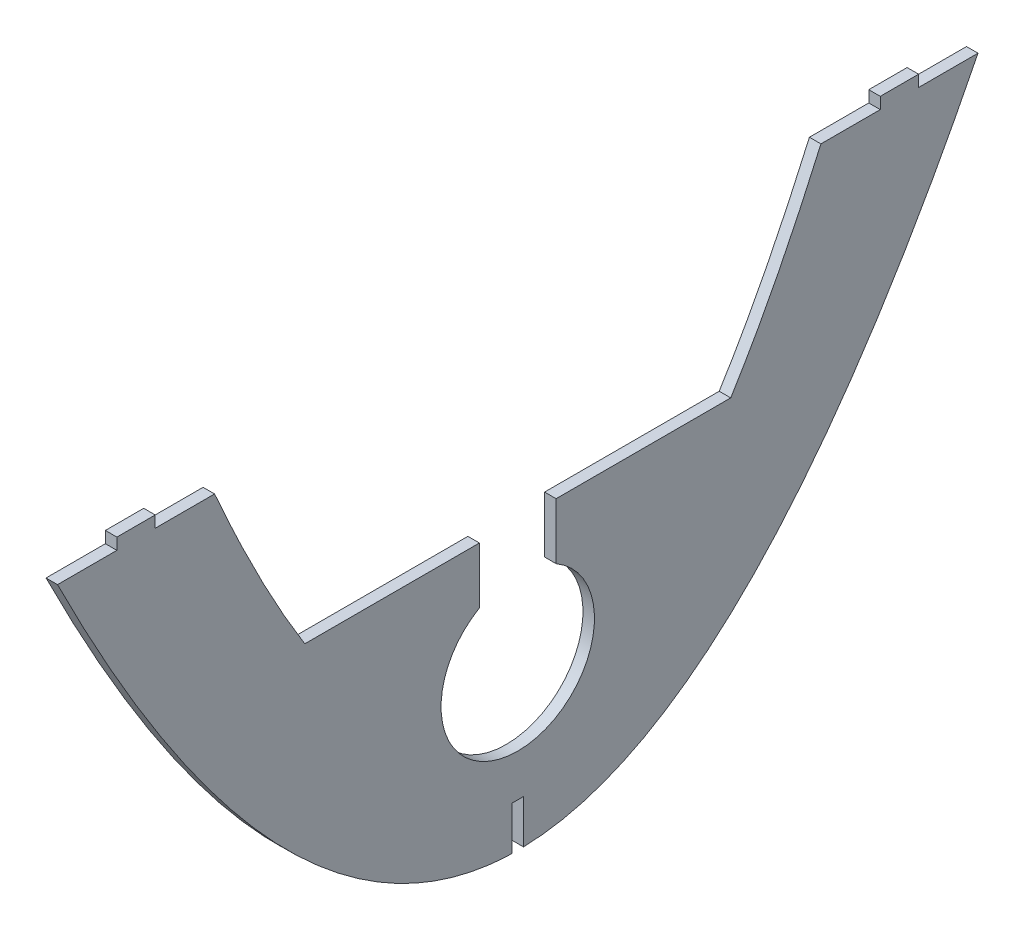
ISO-10303-21;
HEADER;
FILE_DESCRIPTION(('STEP AP214'),'2;1');
FILE_NAME('part.step','',(''),(''),'','','');
FILE_SCHEMA(('AUTOMOTIVE_DESIGN { 1 0 10303 214 1 1 1 1 }'));
ENDSEC;
DATA;
#1=APPLICATION_CONTEXT('core data for automotive mechanical design processes');
#2=APPLICATION_PROTOCOL_DEFINITION('international standard','automotive_design',2000,#1);
#3=PRODUCT_CONTEXT('',#1,'mechanical');
#4=PRODUCT('Part','Part','',(#3));
#5=PRODUCT_RELATED_PRODUCT_CATEGORY('part','',(#4));
#6=PRODUCT_DEFINITION_FORMATION('','',#4);
#7=PRODUCT_DEFINITION_CONTEXT('part definition',#1,'design');
#8=PRODUCT_DEFINITION('design','',#6,#7);
#9=PRODUCT_DEFINITION_SHAPE('','',#8);
#10=(LENGTH_UNIT() NAMED_UNIT(*) SI_UNIT(.MILLI.,.METRE.));
#11=(NAMED_UNIT(*) PLANE_ANGLE_UNIT() SI_UNIT($,.RADIAN.));
#12=(NAMED_UNIT(*) SI_UNIT($,.STERADIAN.) SOLID_ANGLE_UNIT());
#13=UNCERTAINTY_MEASURE_WITH_UNIT(LENGTH_MEASURE(1.E-05),#10,'distance_accuracy_value','');
#14=(GEOMETRIC_REPRESENTATION_CONTEXT(3) GLOBAL_UNCERTAINTY_ASSIGNED_CONTEXT((#13)) GLOBAL_UNIT_ASSIGNED_CONTEXT((#10,
#11,#12)) REPRESENTATION_CONTEXT('',''));
#15=CARTESIAN_POINT('',(0.,0.,0.));
#16=DIRECTION('',(0.,0.,1.));
#17=DIRECTION('',(1.,0.,0.));
#18=AXIS2_PLACEMENT_3D('',#15,#16,#17);
#19=CARTESIAN_POINT('',(3.,119.995200000648,120.000000000324));
#20=CARTESIAN_POINT('',(3.,-119.995200000576,3.56728535599871E-11));
#21=CARTESIAN_POINT('',(3.,119.995200000505,-120.000000000252));
#22=B_SPLINE_CURVE_WITH_KNOTS('',2,(#19,#20,#21),.UNSPECIFIED.,.F.,.F.,(3,3),
(0.0560289772387812,0.943971022760955),.UNSPECIFIED.);
#23=DIRECTION('',(-1.,0.,0.));
#24=VECTOR('',#23,1.);
#25=SURFACE_OF_LINEAR_EXTRUSION('',#22,#24);
#26=CARTESIAN_POINT('',(3.,0.0187492499998734,-1.49999999999523));
#27=VERTEX_POINT('',#26);
#28=CARTESIAN_POINT('',(3.,119.995200000505,-120.000000000252));
#29=VERTEX_POINT('',#28);
#30=EDGE_CURVE('E333',#27,#29,#22,.T.);
#31=ORIENTED_EDGE('',*,*,#30,.F.);
#32=DIRECTION('',(-1.,0.,0.));
#33=VECTOR('',#32,1.);
#34=CARTESIAN_POINT('',(3.,0.0187492499998721,-1.49999999999523));
#35=LINE('',#34,#33);
#36=CARTESIAN_POINT('',(0.,0.0187492499998734,-1.49999999999523));
#37=VERTEX_POINT('',#36);
#38=EDGE_CURVE('E227',#27,#37,#35,.T.);
#39=ORIENTED_EDGE('',*,*,#38,.T.);
#40=CARTESIAN_POINT('',(0.,119.995200000648,120.000000000324));
#41=CARTESIAN_POINT('',(0.,-119.995200000576,3.56728535599871E-11));
#42=CARTESIAN_POINT('',(0.,119.995200000505,-120.000000000252));
#43=B_SPLINE_CURVE_WITH_KNOTS('',2,(#40,#41,#42),.UNSPECIFIED.,.F.,.F.,(3,3),
(0.0560289772387812,0.943971022760955),.UNSPECIFIED.);
#44=CARTESIAN_POINT('',(0.,119.995200000505,-120.000000000252));
#45=VERTEX_POINT('',#44);
#46=EDGE_CURVE('E383',#37,#45,#43,.T.);
#47=ORIENTED_EDGE('',*,*,#46,.T.);
#48=DIRECTION('',(-1.,0.,0.));
#49=VECTOR('',#48,1.);
#50=CARTESIAN_POINT('',(3.,119.995200000505,-120.000000000252));
#51=LINE('',#50,#49);
#52=EDGE_CURVE('E373',#29,#45,#51,.T.);
#53=ORIENTED_EDGE('',*,*,#52,.F.);
#54=EDGE_LOOP('',(#31,#39,#47,#53));
#55=FACE_BOUND('',#54,.T.);
#56=ADVANCED_FACE('F49',(#55),#25,.F.);
#57=CARTESIAN_POINT('',(3.,119.995200000601,-79.0438557402346));
#58=CARTESIAN_POINT('',(3.,-59.9952000006218,8.94423424213642E-12));
#59=CARTESIAN_POINT('',(3.,119.995200000642,79.0438557402525));
#60=B_SPLINE_CURVE_WITH_KNOTS('',2,(#57,#58,#59),.UNSPECIFIED.,.F.,.F.,(3,3),(0.203375214316365,
0.796624785683567),.UNSPECIFIED.);
#61=DIRECTION('',(-1.,0.,0.));
#62=VECTOR('',#61,1.);
#63=SURFACE_OF_LINEAR_EXTRUSION('',#60,#62);
#64=DIRECTION('',(1.,0.,0.));
#65=VECTOR('',#64,1.);
#66=CARTESIAN_POINT('',(0.,74.3999999999906,-55.5200602457932));
#67=LINE('',#66,#65);
#68=CARTESIAN_POINT('',(0.,74.3999999999906,-55.5200602457932));
#69=VERTEX_POINT('',#68);
#70=CARTESIAN_POINT('',(3.,74.3999999999906,-55.5200602457932));
#71=VERTEX_POINT('',#70);
#72=EDGE_CURVE('E236',#69,#71,#67,.T.);
#73=ORIENTED_EDGE('',*,*,#72,.T.);
#74=CARTESIAN_POINT('',(3.,119.995200000567,-79.0438557402195));
#75=VERTEX_POINT('',#74);
#76=EDGE_CURVE('E319',#75,#71,#60,.T.);
#77=ORIENTED_EDGE('',*,*,#76,.F.);
#78=DIRECTION('',(-1.,0.,0.));
#79=VECTOR('',#78,1.);
#80=CARTESIAN_POINT('',(3.,119.995200000567,-79.0438557402195));
#81=LINE('',#80,#79);
#82=CARTESIAN_POINT('',(0.,119.995200000567,-79.0438557402195));
#83=VERTEX_POINT('',#82);
#84=EDGE_CURVE('E399',#75,#83,#81,.T.);
#85=ORIENTED_EDGE('',*,*,#84,.T.);
#86=CARTESIAN_POINT('',(0.,119.995200000601,-79.0438557402346));
#87=CARTESIAN_POINT('',(0.,-59.9952000006218,8.94423424213642E-12));
#88=CARTESIAN_POINT('',(0.,119.995200000642,79.0438557402525));
#89=B_SPLINE_CURVE_WITH_KNOTS('',2,(#86,#87,#88),.UNSPECIFIED.,.F.,.F.,(3,3),(0.203375214316365,
0.796624785683567),.UNSPECIFIED.);
#90=EDGE_CURVE('E451',#83,#69,#89,.T.);
#91=ORIENTED_EDGE('',*,*,#90,.T.);
#92=EDGE_LOOP('',(#73,#77,#85,#91));
#93=FACE_BOUND('',#92,.T.);
#94=ADVANCED_FACE('F51',(#93),#63,.F.);
#95=DIRECTION('',(1.,0.,0.));
#96=VECTOR('',#95,1.);
#97=CARTESIAN_POINT('',(0.,74.3999999999907,55.5200602457931));
#98=LINE('',#97,#96);
#99=CARTESIAN_POINT('',(0.,74.3999999999907,55.5200602457931));
#100=VERTEX_POINT('',#99);
#101=CARTESIAN_POINT('',(3.,74.3999999999907,55.5200602457931));
#102=VERTEX_POINT('',#101);
#103=EDGE_CURVE('E259',#100,#102,#98,.T.);
#104=ORIENTED_EDGE('',*,*,#103,.F.);
#105=CARTESIAN_POINT('',(0.,119.995200000567,79.0438557402194));
#106=VERTEX_POINT('',#105);
#107=EDGE_CURVE('E318',#100,#106,#89,.T.);
#108=ORIENTED_EDGE('',*,*,#107,.T.);
#109=DIRECTION('',(-1.,0.,0.));
#110=VECTOR('',#109,1.);
#111=CARTESIAN_POINT('',(3.,119.995200000567,79.0438557402194));
#112=LINE('',#111,#110);
#113=CARTESIAN_POINT('',(3.,119.995200000567,79.0438557402194));
#114=VERTEX_POINT('',#113);
#115=EDGE_CURVE('E58',#114,#106,#112,.T.);
#116=ORIENTED_EDGE('',*,*,#115,.F.);
#117=EDGE_CURVE('E326',#102,#114,#60,.T.);
#118=ORIENTED_EDGE('',*,*,#117,.F.);
#119=EDGE_LOOP('',(#104,#108,#116,#118));
#120=FACE_BOUND('',#119,.T.);
#121=ADVANCED_FACE('F367',(#120),#63,.F.);
#122=CARTESIAN_POINT('',(3.,119.995200000567,-79.0438557402195));
#123=DIRECTION('',(0.,-1.,0.));
#124=DIRECTION('',(0.,0.,-1.));
#125=AXIS2_PLACEMENT_3D('',#122,#123,#124);
#126=PLANE('',#125);
#127=DIRECTION('',(1.,0.,0.));
#128=VECTOR('',#127,1.);
#129=CARTESIAN_POINT('',(0.,119.995200000567,-94.521927870236));
#130=LINE('',#129,#128);
#131=CARTESIAN_POINT('',(0.,119.995200000567,-94.521927870236));
#132=VERTEX_POINT('',#131);
#133=CARTESIAN_POINT('',(3.,119.995200000567,-94.521927870236));
#134=VERTEX_POINT('',#133);
#135=EDGE_CURVE('E279',#132,#134,#130,.T.);
#136=ORIENTED_EDGE('',*,*,#135,.F.);
#137=DIRECTION('',(0.,0.,1.));
#138=VECTOR('',#137,1.);
#139=CARTESIAN_POINT('',(0.,119.995200000567,-79.0438557402195));
#140=LINE('',#139,#138);
#141=EDGE_CURVE('E389',#132,#83,#140,.T.);
#142=ORIENTED_EDGE('',*,*,#141,.T.);
#143=ORIENTED_EDGE('',*,*,#84,.F.);
#144=DIRECTION('',(0.,0.,1.));
#145=VECTOR('',#144,1.);
#146=CARTESIAN_POINT('',(3.,119.995200000567,-79.0438557402195));
#147=LINE('',#146,#145);
#148=EDGE_CURVE('E338',#134,#75,#147,.T.);
#149=ORIENTED_EDGE('',*,*,#148,.F.);
#150=EDGE_LOOP('',(#136,#142,#143,#149));
#151=FACE_BOUND('',#150,.T.);
#152=ADVANCED_FACE('F359',(#151),#126,.F.);
#153=CARTESIAN_POINT('',(3.,119.995200000567,120.000000000283));
#154=DIRECTION('',(0.,-1.,0.));
#155=DIRECTION('',(0.,0.,-1.));
#156=AXIS2_PLACEMENT_3D('',#153,#154,#155);
#157=PLANE('',#156);
#158=DIRECTION('',(-1.,0.,0.));
#159=VECTOR('',#158,1.);
#160=CARTESIAN_POINT('',(0.,119.995200000567,94.5219278702514));
#161=LINE('',#160,#159);
#162=CARTESIAN_POINT('',(3.,119.995200000567,94.5219278702514));
#163=VERTEX_POINT('',#162);
#164=CARTESIAN_POINT('',(0.,119.995200000567,94.5219278702514));
#165=VERTEX_POINT('',#164);
#166=EDGE_CURVE('E297',#163,#165,#161,.T.);
#167=ORIENTED_EDGE('',*,*,#166,.F.);
#168=DIRECTION('',(0.,0.,1.));
#169=VECTOR('',#168,1.);
#170=CARTESIAN_POINT('',(3.,119.995200000567,120.000000000283));
#171=LINE('',#170,#169);
#172=EDGE_CURVE('E327',#114,#163,#171,.T.);
#173=ORIENTED_EDGE('',*,*,#172,.F.);
#174=ORIENTED_EDGE('',*,*,#115,.T.);
#175=DIRECTION('',(0.,0.,1.));
#176=VECTOR('',#175,1.);
#177=CARTESIAN_POINT('',(0.,119.995200000567,120.000000000283));
#178=LINE('',#177,#176);
#179=EDGE_CURVE('E386',#106,#165,#178,.T.);
#180=ORIENTED_EDGE('',*,*,#179,.T.);
#181=EDGE_LOOP('',(#167,#173,#174,#180));
#182=FACE_BOUND('',#181,.T.);
#183=ADVANCED_FACE('F353',(#182),#157,.F.);
#184=CARTESIAN_POINT('',(3.,119.995200000567,104.521927870251));
#185=VERTEX_POINT('',#184);
#186=CARTESIAN_POINT('',(3.,119.995200000567,120.000000000283));
#187=VERTEX_POINT('',#186);
#188=EDGE_CURVE('E325',#185,#187,#171,.T.);
#189=ORIENTED_EDGE('',*,*,#188,.F.);
#190=DIRECTION('',(-1.,0.,0.));
#191=VECTOR('',#190,1.);
#192=CARTESIAN_POINT('',(0.,119.995200000567,104.521927870251));
#193=LINE('',#192,#191);
#194=CARTESIAN_POINT('',(0.,119.995200000567,104.521927870251));
#195=VERTEX_POINT('',#194);
#196=EDGE_CURVE('E283',#185,#195,#193,.T.);
#197=ORIENTED_EDGE('',*,*,#196,.T.);
#198=CARTESIAN_POINT('',(0.,119.995200000567,120.000000000283));
#199=VERTEX_POINT('',#198);
#200=EDGE_CURVE('E390',#195,#199,#178,.T.);
#201=ORIENTED_EDGE('',*,*,#200,.T.);
#202=DIRECTION('',(-1.,0.,0.));
#203=VECTOR('',#202,1.);
#204=CARTESIAN_POINT('',(3.,119.995200000567,120.000000000283));
#205=LINE('',#204,#203);
#206=EDGE_CURVE('E403',#187,#199,#205,.T.);
#207=ORIENTED_EDGE('',*,*,#206,.F.);
#208=EDGE_LOOP('',(#189,#197,#201,#207));
#209=FACE_BOUND('',#208,.T.);
#210=ADVANCED_FACE('F349',(#209),#157,.F.);
#211=CARTESIAN_POINT('',(0.,0.0187492500001104,1.50000000000477));
#212=VERTEX_POINT('',#211);
#213=EDGE_CURVE('E385',#199,#212,#43,.T.);
#214=ORIENTED_EDGE('',*,*,#213,.T.);
#215=DIRECTION('',(-1.,0.,0.));
#216=VECTOR('',#215,1.);
#217=CARTESIAN_POINT('',(3.,0.0187492500001104,1.50000000000477));
#218=LINE('',#217,#216);
#219=CARTESIAN_POINT('',(3.,0.0187492500001094,1.50000000000477));
#220=VERTEX_POINT('',#219);
#221=EDGE_CURVE('E64',#212,#220,#218,.F.);
#222=ORIENTED_EDGE('',*,*,#221,.T.);
#223=EDGE_CURVE('E216',#187,#220,#22,.T.);
#224=ORIENTED_EDGE('',*,*,#223,.F.);
#225=ORIENTED_EDGE('',*,*,#206,.T.);
#226=EDGE_LOOP('',(#214,#222,#224,#225));
#227=FACE_BOUND('',#226,.T.);
#228=ADVANCED_FACE('F345',(#227),#25,.F.);
#229=CARTESIAN_POINT('',(0.,119.995200000567,-104.521927870236));
#230=VERTEX_POINT('',#229);
#231=EDGE_CURVE('E384',#45,#230,#140,.T.);
#232=ORIENTED_EDGE('',*,*,#231,.T.);
#233=DIRECTION('',(1.,0.,0.));
#234=VECTOR('',#233,1.);
#235=CARTESIAN_POINT('',(0.,119.995200000567,-104.521927870236));
#236=LINE('',#235,#234);
#237=CARTESIAN_POINT('',(3.,119.995200000567,-104.521927870236));
#238=VERTEX_POINT('',#237);
#239=EDGE_CURVE('E277',#230,#238,#236,.T.);
#240=ORIENTED_EDGE('',*,*,#239,.T.);
#241=EDGE_CURVE('E339',#29,#238,#147,.T.);
#242=ORIENTED_EDGE('',*,*,#241,.F.);
#243=ORIENTED_EDGE('',*,*,#52,.T.);
#244=EDGE_LOOP('',(#232,#240,#242,#243));
#245=FACE_BOUND('',#244,.T.);
#246=ADVANCED_FACE('F348',(#245),#126,.F.);
#247=CARTESIAN_POINT('',(3.,29.9999999999999,8.94423424213642E-12));
#248=DIRECTION('',(-1.,0.,0.));
#249=DIRECTION('',(0.,0.,1.));
#250=AXIS2_PLACEMENT_3D('',#247,#248,#249);
#251=PLANE('',#250);
#252=DIRECTION('',(0.,0.,-1.));
#253=VECTOR('',#252,1.);
#254=CARTESIAN_POINT('',(3.,11.4,-1.49999999999523));
#255=LINE('',#254,#253);
#256=CARTESIAN_POINT('',(3.,11.4,1.50000000000477));
#257=VERTEX_POINT('',#256);
#258=CARTESIAN_POINT('',(3.,11.4,-1.49999999999523));
#259=VERTEX_POINT('',#258);
#260=EDGE_CURVE('E206',#257,#259,#255,.T.);
#261=ORIENTED_EDGE('',*,*,#260,.T.);
#262=DIRECTION('',(0.,-1.,0.));
#263=VECTOR('',#262,1.);
#264=CARTESIAN_POINT('',(3.,11.4,-1.49999999999523));
#265=LINE('',#264,#263);
#266=EDGE_CURVE('E217',#259,#27,#265,.T.);
#267=ORIENTED_EDGE('',*,*,#266,.T.);
#268=ORIENTED_EDGE('',*,*,#30,.T.);
#269=ORIENTED_EDGE('',*,*,#241,.T.);
#270=DIRECTION('',(0.,-1.,0.));
#271=VECTOR('',#270,1.);
#272=CARTESIAN_POINT('',(3.,122.995200000567,-104.521927870236));
#273=LINE('',#272,#271);
#274=CARTESIAN_POINT('',(3.,122.995200000567,-104.521927870236));
#275=VERTEX_POINT('',#274);
#276=EDGE_CURVE('E267',#275,#238,#273,.T.);
#277=ORIENTED_EDGE('',*,*,#276,.F.);
#278=DIRECTION('',(0.,0.,-1.));
#279=VECTOR('',#278,1.);
#280=CARTESIAN_POINT('',(3.,122.995200000567,-94.521927870236));
#281=LINE('',#280,#279);
#282=CARTESIAN_POINT('',(3.,122.995200000567,-94.521927870236));
#283=VERTEX_POINT('',#282);
#284=EDGE_CURVE('E289',#283,#275,#281,.T.);
#285=ORIENTED_EDGE('',*,*,#284,.F.);
#286=DIRECTION('',(0.,-1.,0.));
#287=VECTOR('',#286,1.);
#288=CARTESIAN_POINT('',(3.,122.995200000567,-94.521927870236));
#289=LINE('',#288,#287);
#290=EDGE_CURVE('E261',#283,#134,#289,.T.);
#291=ORIENTED_EDGE('',*,*,#290,.T.);
#292=ORIENTED_EDGE('',*,*,#148,.T.);
#293=ORIENTED_EDGE('',*,*,#76,.T.);
#294=DIRECTION('',(0.,0.,-1.));
#295=VECTOR('',#294,1.);
#296=CARTESIAN_POINT('',(3.,74.4,0.));
#297=LINE('',#296,#295);
#298=CARTESIAN_POINT('',(3.,74.4,-10.));
#299=VERTEX_POINT('',#298);
#300=EDGE_CURVE('E230',#299,#71,#297,.T.);
#301=ORIENTED_EDGE('',*,*,#300,.F.);
#302=DIRECTION('',(0.,1.,0.));
#303=VECTOR('',#302,1.);
#304=CARTESIAN_POINT('',(3.,0.,-10.));
#305=LINE('',#304,#303);
#306=CARTESIAN_POINT('',(3.,59.7205080756888,-10.));
#307=VERTEX_POINT('',#306);
#308=EDGE_CURVE('E234',#307,#299,#305,.T.);
#309=ORIENTED_EDGE('',*,*,#308,.F.);
#310=CARTESIAN_POINT('',(3.,42.4,0.));
#311=DIRECTION('',(1.,0.,0.));
#312=DIRECTION('',(0.,0.,-1.));
#313=AXIS2_PLACEMENT_3D('',#310,#311,#312);
#314=CIRCLE('',#313,20.);
#315=CARTESIAN_POINT('',(3.,59.7205080756888,10.));
#316=VERTEX_POINT('',#315);
#317=EDGE_CURVE('E242',#316,#307,#314,.T.);
#318=ORIENTED_EDGE('',*,*,#317,.F.);
#319=DIRECTION('',(0.,1.,0.));
#320=VECTOR('',#319,1.);
#321=CARTESIAN_POINT('',(3.,0.,10.));
#322=LINE('',#321,#320);
#323=CARTESIAN_POINT('',(3.,74.4,10.));
#324=VERTEX_POINT('',#323);
#325=EDGE_CURVE('E256',#316,#324,#322,.T.);
#326=ORIENTED_EDGE('',*,*,#325,.T.);
#327=DIRECTION('',(0.,0.,-1.));
#328=VECTOR('',#327,1.);
#329=CARTESIAN_POINT('',(3.,74.4,0.));
#330=LINE('',#329,#328);
#331=EDGE_CURVE('E72',#102,#324,#330,.T.);
#332=ORIENTED_EDGE('',*,*,#331,.F.);
#333=ORIENTED_EDGE('',*,*,#117,.T.);
#334=ORIENTED_EDGE('',*,*,#172,.T.);
#335=DIRECTION('',(0.,-1.,0.));
#336=VECTOR('',#335,1.);
#337=CARTESIAN_POINT('',(3.,122.995200000567,94.5219278702514));
#338=LINE('',#337,#336);
#339=CARTESIAN_POINT('',(3.,122.995200000567,94.5219278702514));
#340=VERTEX_POINT('',#339);
#341=EDGE_CURVE('E313',#340,#163,#338,.T.);
#342=ORIENTED_EDGE('',*,*,#341,.F.);
#343=DIRECTION('',(0.,0.,-1.));
#344=VECTOR('',#343,1.);
#345=CARTESIAN_POINT('',(3.,122.995200000567,1.27834046167843E-13));
#346=LINE('',#345,#344);
#347=CARTESIAN_POINT('',(3.,122.995200000567,104.521927870251));
#348=VERTEX_POINT('',#347);
#349=EDGE_CURVE('E296',#348,#340,#346,.T.);
#350=ORIENTED_EDGE('',*,*,#349,.F.);
#351=DIRECTION('',(0.,-1.,0.));
#352=VECTOR('',#351,1.);
#353=CARTESIAN_POINT('',(3.,122.995200000567,104.521927870251));
#354=LINE('',#353,#352);
#355=EDGE_CURVE('E316',#348,#185,#354,.T.);
#356=ORIENTED_EDGE('',*,*,#355,.T.);
#357=ORIENTED_EDGE('',*,*,#188,.T.);
#358=ORIENTED_EDGE('',*,*,#223,.T.);
#359=DIRECTION('',(0.,1.,0.));
#360=VECTOR('',#359,1.);
#361=CARTESIAN_POINT('',(3.,11.4,1.50000000000477));
#362=LINE('',#361,#360);
#363=EDGE_CURVE('E201',#220,#257,#362,.T.);
#364=ORIENTED_EDGE('',*,*,#363,.T.);
#365=EDGE_LOOP('',(#261,#267,#268,#269,#277,#285,#291,#292,#293,#301,#309,#318,#326,#332,#333,
#334,#342,#350,#356,#357,#358,#364));
#366=FACE_BOUND('',#365,.T.);
#367=ADVANCED_FACE('F214',(#366),#251,.F.);
#368=CARTESIAN_POINT('',(0.,29.9999999999999,8.94423424213642E-12));
#369=DIRECTION('',(-1.,0.,0.));
#370=DIRECTION('',(0.,0.,1.));
#371=AXIS2_PLACEMENT_3D('',#368,#369,#370);
#372=PLANE('',#371);
#373=DIRECTION('',(0.,-1.,0.));
#374=VECTOR('',#373,1.);
#375=CARTESIAN_POINT('',(0.,11.4,-1.49999999999523));
#376=LINE('',#375,#374);
#377=CARTESIAN_POINT('',(0.,11.4,-1.49999999999523));
#378=VERTEX_POINT('',#377);
#379=EDGE_CURVE('E222',#378,#37,#376,.T.);
#380=ORIENTED_EDGE('',*,*,#379,.F.);
#381=DIRECTION('',(0.,0.,-1.));
#382=VECTOR('',#381,1.);
#383=CARTESIAN_POINT('',(0.,11.4,-1.49999999999523));
#384=LINE('',#383,#382);
#385=CARTESIAN_POINT('',(0.,11.4,1.50000000000477));
#386=VERTEX_POINT('',#385);
#387=EDGE_CURVE('E219',#386,#378,#384,.T.);
#388=ORIENTED_EDGE('',*,*,#387,.F.);
#389=DIRECTION('',(0.,1.,0.));
#390=VECTOR('',#389,1.);
#391=CARTESIAN_POINT('',(0.,29.9999999999999,1.50000000000477));
#392=LINE('',#391,#390);
#393=EDGE_CURVE('E14',#212,#386,#392,.T.);
#394=ORIENTED_EDGE('',*,*,#393,.F.);
#395=ORIENTED_EDGE('',*,*,#213,.F.);
#396=ORIENTED_EDGE('',*,*,#200,.F.);
#397=DIRECTION('',(0.,-1.,0.));
#398=VECTOR('',#397,1.);
#399=CARTESIAN_POINT('',(0.,122.995200000567,104.521927870251));
#400=LINE('',#399,#398);
#401=CARTESIAN_POINT('',(0.,122.995200000567,104.521927870251));
#402=VERTEX_POINT('',#401);
#403=EDGE_CURVE('E303',#402,#195,#400,.T.);
#404=ORIENTED_EDGE('',*,*,#403,.F.);
#405=DIRECTION('',(0.,0.,1.));
#406=VECTOR('',#405,1.);
#407=CARTESIAN_POINT('',(0.,122.995200000567,1.27834046167843E-13));
#408=LINE('',#407,#406);
#409=CARTESIAN_POINT('',(0.,122.995200000567,94.5219278702514));
#410=VERTEX_POINT('',#409);
#411=EDGE_CURVE('E301',#410,#402,#408,.T.);
#412=ORIENTED_EDGE('',*,*,#411,.F.);
#413=DIRECTION('',(0.,-1.,0.));
#414=VECTOR('',#413,1.);
#415=CARTESIAN_POINT('',(0.,122.995200000567,94.5219278702514));
#416=LINE('',#415,#414);
#417=EDGE_CURVE('E310',#410,#165,#416,.T.);
#418=ORIENTED_EDGE('',*,*,#417,.T.);
#419=ORIENTED_EDGE('',*,*,#179,.F.);
#420=ORIENTED_EDGE('',*,*,#107,.F.);
#421=DIRECTION('',(0.,0.,-1.));
#422=VECTOR('',#421,1.);
#423=CARTESIAN_POINT('',(0.,74.4,0.));
#424=LINE('',#423,#422);
#425=CARTESIAN_POINT('',(0.,74.4,10.));
#426=VERTEX_POINT('',#425);
#427=EDGE_CURVE('E253',#100,#426,#424,.T.);
#428=ORIENTED_EDGE('',*,*,#427,.T.);
#429=DIRECTION('',(0.,1.,0.));
#430=VECTOR('',#429,1.);
#431=CARTESIAN_POINT('',(0.,0.,10.));
#432=LINE('',#431,#430);
#433=CARTESIAN_POINT('',(0.,59.7205080756888,10.));
#434=VERTEX_POINT('',#433);
#435=EDGE_CURVE('E250',#434,#426,#432,.T.);
#436=ORIENTED_EDGE('',*,*,#435,.F.);
#437=CARTESIAN_POINT('',(0.,42.4,0.));
#438=DIRECTION('',(1.,0.,0.));
#439=DIRECTION('',(0.,0.,-1.));
#440=AXIS2_PLACEMENT_3D('',#437,#438,#439);
#441=CIRCLE('',#440,20.);
#442=CARTESIAN_POINT('',(0.,59.7205080756888,-10.));
#443=VERTEX_POINT('',#442);
#444=EDGE_CURVE('E248',#434,#443,#441,.T.);
#445=ORIENTED_EDGE('',*,*,#444,.T.);
#446=DIRECTION('',(0.,1.,0.));
#447=VECTOR('',#446,1.);
#448=CARTESIAN_POINT('',(0.,0.,-10.));
#449=LINE('',#448,#447);
#450=CARTESIAN_POINT('',(0.,74.4,-10.));
#451=VERTEX_POINT('',#450);
#452=EDGE_CURVE('E233',#443,#451,#449,.T.);
#453=ORIENTED_EDGE('',*,*,#452,.T.);
#454=DIRECTION('',(0.,0.,-1.));
#455=VECTOR('',#454,1.);
#456=CARTESIAN_POINT('',(0.,74.4,0.));
#457=LINE('',#456,#455);
#458=EDGE_CURVE('E231',#451,#69,#457,.T.);
#459=ORIENTED_EDGE('',*,*,#458,.T.);
#460=ORIENTED_EDGE('',*,*,#90,.F.);
#461=ORIENTED_EDGE('',*,*,#141,.F.);
#462=DIRECTION('',(0.,-1.,0.));
#463=VECTOR('',#462,1.);
#464=CARTESIAN_POINT('',(0.,122.995200000567,-94.521927870236));
#465=LINE('',#464,#463);
#466=CARTESIAN_POINT('',(0.,122.995200000567,-94.521927870236));
#467=VERTEX_POINT('',#466);
#468=EDGE_CURVE('E273',#467,#132,#465,.T.);
#469=ORIENTED_EDGE('',*,*,#468,.F.);
#470=DIRECTION('',(0.,0.,-1.));
#471=VECTOR('',#470,1.);
#472=CARTESIAN_POINT('',(0.,122.995200000567,-94.521927870236));
#473=LINE('',#472,#471);
#474=CARTESIAN_POINT('',(0.,122.995200000567,-104.521927870236));
#475=VERTEX_POINT('',#474);
#476=EDGE_CURVE('E276',#467,#475,#473,.T.);
#477=ORIENTED_EDGE('',*,*,#476,.T.);
#478=DIRECTION('',(0.,-1.,0.));
#479=VECTOR('',#478,1.);
#480=CARTESIAN_POINT('',(0.,122.995200000567,-104.521927870236));
#481=LINE('',#480,#479);
#482=EDGE_CURVE('E270',#475,#230,#481,.T.);
#483=ORIENTED_EDGE('',*,*,#482,.T.);
#484=ORIENTED_EDGE('',*,*,#231,.F.);
#485=ORIENTED_EDGE('',*,*,#46,.F.);
#486=EDGE_LOOP('',(#380,#388,#394,#395,#396,#404,#412,#418,#419,#420,#428,#436,#445,#453,#459,
#460,#461,#469,#477,#483,#484,#485));
#487=FACE_BOUND('',#486,.T.);
#488=ADVANCED_FACE('F381',(#487),#372,.T.);
#489=CARTESIAN_POINT('',(0.,122.995200000567,104.521927870251));
#490=DIRECTION('',(0.,0.,1.));
#491=DIRECTION('',(0.,-1.,0.));
#492=AXIS2_PLACEMENT_3D('',#489,#490,#491);
#493=PLANE('',#492);
#494=ORIENTED_EDGE('',*,*,#196,.F.);
#495=ORIENTED_EDGE('',*,*,#355,.F.);
#496=DIRECTION('',(-1.,0.,0.));
#497=VECTOR('',#496,1.);
#498=CARTESIAN_POINT('',(0.,122.995200000567,104.521927870251));
#499=LINE('',#498,#497);
#500=EDGE_CURVE('E293',#348,#402,#499,.T.);
#501=ORIENTED_EDGE('',*,*,#500,.T.);
#502=ORIENTED_EDGE('',*,*,#403,.T.);
#503=EDGE_LOOP('',(#494,#495,#501,#502));
#504=FACE_BOUND('',#503,.T.);
#505=ADVANCED_FACE('F449',(#504),#493,.T.);
#506=CARTESIAN_POINT('',(0.,122.995200000567,94.5219278702514));
#507=DIRECTION('',(0.,0.,1.));
#508=DIRECTION('',(0.,-1.,0.));
#509=AXIS2_PLACEMENT_3D('',#506,#507,#508);
#510=PLANE('',#509);
#511=ORIENTED_EDGE('',*,*,#166,.T.);
#512=ORIENTED_EDGE('',*,*,#417,.F.);
#513=DIRECTION('',(-1.,0.,0.));
#514=VECTOR('',#513,1.);
#515=CARTESIAN_POINT('',(0.,122.995200000567,94.5219278702514));
#516=LINE('',#515,#514);
#517=EDGE_CURVE('E299',#340,#410,#516,.T.);
#518=ORIENTED_EDGE('',*,*,#517,.F.);
#519=ORIENTED_EDGE('',*,*,#341,.T.);
#520=EDGE_LOOP('',(#511,#512,#518,#519));
#521=FACE_BOUND('',#520,.T.);
#522=ADVANCED_FACE('F438',(#521),#510,.F.);
#523=CARTESIAN_POINT('',(0.,122.995200000567,1.27834046167843E-13));
#524=DIRECTION('',(0.,1.,0.));
#525=DIRECTION('',(0.,0.,1.));
#526=AXIS2_PLACEMENT_3D('',#523,#524,#525);
#527=PLANE('',#526);
#528=ORIENTED_EDGE('',*,*,#500,.F.);
#529=ORIENTED_EDGE('',*,*,#349,.T.);
#530=ORIENTED_EDGE('',*,*,#517,.T.);
#531=ORIENTED_EDGE('',*,*,#411,.T.);
#532=EDGE_LOOP('',(#528,#529,#530,#531));
#533=FACE_BOUND('',#532,.T.);
#534=ADVANCED_FACE('F444',(#533),#527,.T.);
#535=CARTESIAN_POINT('',(0.,122.995200000567,-94.521927870236));
#536=DIRECTION('',(0.,0.,-1.));
#537=DIRECTION('',(0.,1.,0.));
#538=AXIS2_PLACEMENT_3D('',#535,#536,#537);
#539=PLANE('',#538);
#540=ORIENTED_EDGE('',*,*,#135,.T.);
#541=ORIENTED_EDGE('',*,*,#290,.F.);
#542=DIRECTION('',(1.,0.,0.));
#543=VECTOR('',#542,1.);
#544=CARTESIAN_POINT('',(0.,122.995200000567,-94.521927870236));
#545=LINE('',#544,#543);
#546=EDGE_CURVE('E280',#467,#283,#545,.T.);
#547=ORIENTED_EDGE('',*,*,#546,.F.);
#548=ORIENTED_EDGE('',*,*,#468,.T.);
#549=EDGE_LOOP('',(#540,#541,#547,#548));
#550=FACE_BOUND('',#549,.T.);
#551=ADVANCED_FACE('F465',(#550),#539,.F.);
#552=CARTESIAN_POINT('',(0.,122.995200000567,-104.521927870236));
#553=DIRECTION('',(0.,0.,-1.));
#554=DIRECTION('',(0.,1.,0.));
#555=AXIS2_PLACEMENT_3D('',#552,#553,#554);
#556=PLANE('',#555);
#557=ORIENTED_EDGE('',*,*,#239,.F.);
#558=ORIENTED_EDGE('',*,*,#482,.F.);
#559=DIRECTION('',(1.,0.,0.));
#560=VECTOR('',#559,1.);
#561=CARTESIAN_POINT('',(0.,122.995200000567,-104.521927870236));
#562=LINE('',#561,#560);
#563=EDGE_CURVE('E286',#475,#275,#562,.T.);
#564=ORIENTED_EDGE('',*,*,#563,.T.);
#565=ORIENTED_EDGE('',*,*,#276,.T.);
#566=EDGE_LOOP('',(#557,#558,#564,#565));
#567=FACE_BOUND('',#566,.T.);
#568=ADVANCED_FACE('F472',(#567),#556,.T.);
#569=CARTESIAN_POINT('',(0.,122.995200000567,1.6957639803895E-13));
#570=DIRECTION('',(0.,1.,0.));
#571=DIRECTION('',(0.,0.,1.));
#572=AXIS2_PLACEMENT_3D('',#569,#570,#571);
#573=PLANE('',#572);
#574=ORIENTED_EDGE('',*,*,#546,.T.);
#575=ORIENTED_EDGE('',*,*,#284,.T.);
#576=ORIENTED_EDGE('',*,*,#563,.F.);
#577=ORIENTED_EDGE('',*,*,#476,.F.);
#578=EDGE_LOOP('',(#574,#575,#576,#577));
#579=FACE_BOUND('',#578,.T.);
#580=ADVANCED_FACE('F469',(#579),#573,.T.);
#581=CARTESIAN_POINT('',(0.,42.4,0.));
#582=DIRECTION('',(1.,0.,0.));
#583=DIRECTION('',(0.,0.,-1.));
#584=AXIS2_PLACEMENT_3D('',#581,#582,#583);
#585=CYLINDRICAL_SURFACE('',#584,20.);
#586=ORIENTED_EDGE('',*,*,#317,.T.);
#587=DIRECTION('',(1.,0.,0.));
#588=VECTOR('',#587,1.);
#589=CARTESIAN_POINT('',(0.,59.7205080756888,-10.));
#590=LINE('',#589,#588);
#591=EDGE_CURVE('E239',#443,#307,#590,.T.);
#592=ORIENTED_EDGE('',*,*,#591,.F.);
#593=ORIENTED_EDGE('',*,*,#444,.F.);
#594=DIRECTION('',(1.,0.,0.));
#595=VECTOR('',#594,1.);
#596=CARTESIAN_POINT('',(0.,59.7205080756888,10.));
#597=LINE('',#596,#595);
#598=EDGE_CURVE('E255',#434,#316,#597,.T.);
#599=ORIENTED_EDGE('',*,*,#598,.T.);
#600=EDGE_LOOP('',(#586,#592,#593,#599));
#601=FACE_BOUND('',#600,.T.);
#602=ADVANCED_FACE('F411',(#601),#585,.F.);
#603=CARTESIAN_POINT('',(0.,74.4,0.));
#604=DIRECTION('',(0.,-1.,0.));
#605=DIRECTION('',(0.,0.,-1.));
#606=AXIS2_PLACEMENT_3D('',#603,#604,#605);
#607=PLANE('',#606);
#608=ORIENTED_EDGE('',*,*,#331,.T.);
#609=DIRECTION('',(1.,0.,0.));
#610=VECTOR('',#609,1.);
#611=CARTESIAN_POINT('',(0.,74.4,10.));
#612=LINE('',#611,#610);
#613=EDGE_CURVE('E262',#426,#324,#612,.T.);
#614=ORIENTED_EDGE('',*,*,#613,.F.);
#615=ORIENTED_EDGE('',*,*,#427,.F.);
#616=ORIENTED_EDGE('',*,*,#103,.T.);
#617=EDGE_LOOP('',(#608,#614,#615,#616));
#618=FACE_BOUND('',#617,.T.);
#619=ADVANCED_FACE('F428',(#618),#607,.F.);
#620=CARTESIAN_POINT('',(0.,0.,10.));
#621=DIRECTION('',(0.,0.,-1.));
#622=DIRECTION('',(-1.,0.,0.));
#623=AXIS2_PLACEMENT_3D('',#620,#621,#622);
#624=PLANE('',#623);
#625=ORIENTED_EDGE('',*,*,#325,.F.);
#626=ORIENTED_EDGE('',*,*,#598,.F.);
#627=ORIENTED_EDGE('',*,*,#435,.T.);
#628=ORIENTED_EDGE('',*,*,#613,.T.);
#629=EDGE_LOOP('',(#625,#626,#627,#628));
#630=FACE_BOUND('',#629,.T.);
#631=ADVANCED_FACE('F426',(#630),#624,.T.);
#632=CARTESIAN_POINT('',(0.,0.,-10.));
#633=DIRECTION('',(0.,0.,-1.));
#634=DIRECTION('',(0.,1.,0.));
#635=AXIS2_PLACEMENT_3D('',#632,#633,#634);
#636=PLANE('',#635);
#637=ORIENTED_EDGE('',*,*,#308,.T.);
#638=DIRECTION('',(1.,0.,0.));
#639=VECTOR('',#638,1.);
#640=CARTESIAN_POINT('',(0.,74.4,-10.));
#641=LINE('',#640,#639);
#642=EDGE_CURVE('E243',#451,#299,#641,.T.);
#643=ORIENTED_EDGE('',*,*,#642,.F.);
#644=ORIENTED_EDGE('',*,*,#452,.F.);
#645=ORIENTED_EDGE('',*,*,#591,.T.);
#646=EDGE_LOOP('',(#637,#643,#644,#645));
#647=FACE_BOUND('',#646,.T.);
#648=ADVANCED_FACE('F418',(#647),#636,.F.);
#649=CARTESIAN_POINT('',(0.,74.4,0.));
#650=DIRECTION('',(0.,-1.,0.));
#651=DIRECTION('',(0.,0.,-1.));
#652=AXIS2_PLACEMENT_3D('',#649,#650,#651);
#653=PLANE('',#652);
#654=ORIENTED_EDGE('',*,*,#300,.T.);
#655=ORIENTED_EDGE('',*,*,#72,.F.);
#656=ORIENTED_EDGE('',*,*,#458,.F.);
#657=ORIENTED_EDGE('',*,*,#642,.T.);
#658=EDGE_LOOP('',(#654,#655,#656,#657));
#659=FACE_BOUND('',#658,.T.);
#660=ADVANCED_FACE('F517',(#659),#653,.F.);
#661=CARTESIAN_POINT('',(3.,11.4,-1.49999999999523));
#662=DIRECTION('',(0.,0.,-1.));
#663=DIRECTION('',(-1.,0.,0.));
#664=AXIS2_PLACEMENT_3D('',#661,#662,#663);
#665=PLANE('',#664);
#666=ORIENTED_EDGE('',*,*,#266,.F.);
#667=DIRECTION('',(-1.,0.,0.));
#668=VECTOR('',#667,1.);
#669=CARTESIAN_POINT('',(3.,11.4,-1.49999999999523));
#670=LINE('',#669,#668);
#671=EDGE_CURVE('E205',#259,#378,#670,.T.);
#672=ORIENTED_EDGE('',*,*,#671,.T.);
#673=ORIENTED_EDGE('',*,*,#379,.T.);
#674=ORIENTED_EDGE('',*,*,#38,.F.);
#675=EDGE_LOOP('',(#666,#672,#673,#674));
#676=FACE_BOUND('',#675,.T.);
#677=ADVANCED_FACE('F378',(#676),#665,.F.);
#678=CARTESIAN_POINT('',(3.,11.4,1.50000000000477));
#679=DIRECTION('',(0.,0.,1.));
#680=DIRECTION('',(0.,-1.,0.));
#681=AXIS2_PLACEMENT_3D('',#678,#679,#680);
#682=PLANE('',#681);
#683=ORIENTED_EDGE('',*,*,#393,.T.);
#684=DIRECTION('',(-1.,0.,0.));
#685=VECTOR('',#684,1.);
#686=CARTESIAN_POINT('',(3.,11.4,1.50000000000477));
#687=LINE('',#686,#685);
#688=EDGE_CURVE('E197',#257,#386,#687,.T.);
#689=ORIENTED_EDGE('',*,*,#688,.F.);
#690=ORIENTED_EDGE('',*,*,#363,.F.);
#691=ORIENTED_EDGE('',*,*,#221,.F.);
#692=EDGE_LOOP('',(#683,#689,#690,#691));
#693=FACE_BOUND('',#692,.T.);
#694=ADVANCED_FACE('F199',(#693),#682,.F.);
#695=CARTESIAN_POINT('',(3.,11.4,-1.49999999999523));
#696=DIRECTION('',(0.,1.,0.));
#697=DIRECTION('',(0.,0.,1.));
#698=AXIS2_PLACEMENT_3D('',#695,#696,#697);
#699=PLANE('',#698);
#700=ORIENTED_EDGE('',*,*,#387,.T.);
#701=ORIENTED_EDGE('',*,*,#671,.F.);
#702=ORIENTED_EDGE('',*,*,#260,.F.);
#703=ORIENTED_EDGE('',*,*,#688,.T.);
#704=EDGE_LOOP('',(#700,#701,#702,#703));
#705=FACE_BOUND('',#704,.T.);
#706=ADVANCED_FACE('F209',(#705),#699,.F.);
#707=CLOSED_SHELL('',(#56,#94,#121,#152,#183,#210,#228,#246,#367,#488,#505,#522,#534,#551,#568,
#580,#602,#619,#631,#648,#660,#677,#694,#706));
#708=MANIFOLD_SOLID_BREP('B2',#707);
#709=ADVANCED_BREP_SHAPE_REPRESENTATION('',(#18,#708),#14);
#710=SHAPE_DEFINITION_REPRESENTATION(#9,#709);
ENDSEC;
END-ISO-10303-21;
